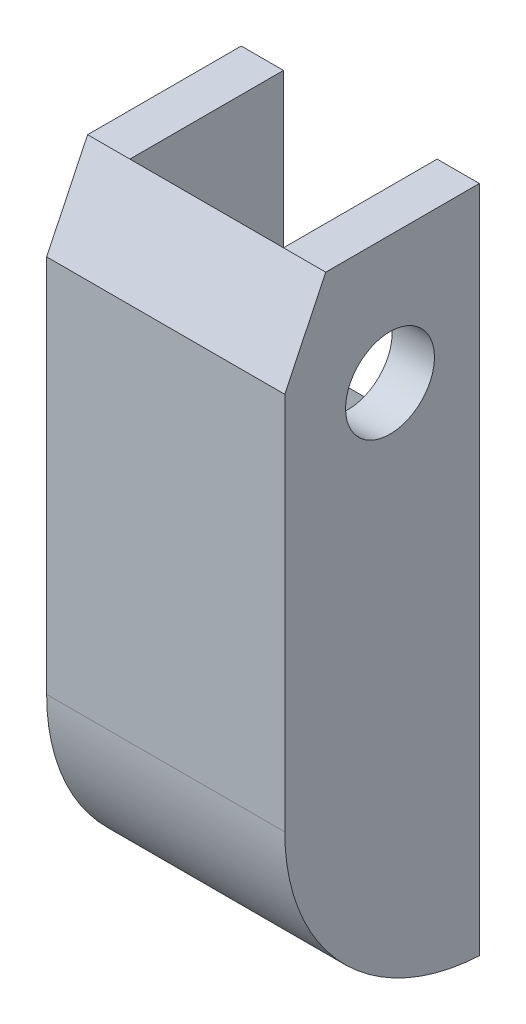
ISO-10303-21;
HEADER;
FILE_DESCRIPTION(('STEP AP214'),'2;1');
FILE_NAME('part.step','',(''),(''),'','','');
FILE_SCHEMA(('AUTOMOTIVE_DESIGN { 1 0 10303 214 1 1 1 1 }'));
ENDSEC;
DATA;
#1=APPLICATION_CONTEXT('core data for automotive mechanical design processes');
#2=APPLICATION_PROTOCOL_DEFINITION('international standard','automotive_design',2000,#1);
#3=PRODUCT_CONTEXT('',#1,'mechanical');
#4=PRODUCT('Part','Part','',(#3));
#5=PRODUCT_RELATED_PRODUCT_CATEGORY('part','',(#4));
#6=PRODUCT_DEFINITION_FORMATION('','',#4);
#7=PRODUCT_DEFINITION_CONTEXT('part definition',#1,'design');
#8=PRODUCT_DEFINITION('design','',#6,#7);
#9=PRODUCT_DEFINITION_SHAPE('','',#8);
#10=(LENGTH_UNIT() NAMED_UNIT(*) SI_UNIT(.MILLI.,.METRE.));
#11=(NAMED_UNIT(*) PLANE_ANGLE_UNIT() SI_UNIT($,.RADIAN.));
#12=(NAMED_UNIT(*) SI_UNIT($,.STERADIAN.) SOLID_ANGLE_UNIT());
#13=UNCERTAINTY_MEASURE_WITH_UNIT(LENGTH_MEASURE(1.E-05),#10,'distance_accuracy_value','');
#14=(GEOMETRIC_REPRESENTATION_CONTEXT(3) GLOBAL_UNCERTAINTY_ASSIGNED_CONTEXT((#13)) GLOBAL_UNIT_ASSIGNED_CONTEXT((#10,
#11,#12)) REPRESENTATION_CONTEXT('',''));
#15=CARTESIAN_POINT('',(0.,0.,0.));
#16=DIRECTION('',(0.,0.,1.));
#17=DIRECTION('',(1.,0.,0.));
#18=AXIS2_PLACEMENT_3D('',#15,#16,#17);
#19=CARTESIAN_POINT('',(0.,0.,7.62));
#20=DIRECTION('',(0.,0.,-1.));
#21=DIRECTION('',(-1.,0.,0.));
#22=AXIS2_PLACEMENT_3D('',#19,#20,#21);
#23=PLANE('',#22);
#24=DIRECTION('',(0.,-1.,0.));
#25=VECTOR('',#24,1.);
#26=CARTESIAN_POINT('',(9.7155,45.98924,7.62));
#27=LINE('',#26,#25);
#28=CARTESIAN_POINT('',(9.7155,33.17494,7.62));
#29=VERTEX_POINT('',#28);
#30=CARTESIAN_POINT('',(9.7155,26.82494,7.62));
#31=VERTEX_POINT('',#30);
#32=EDGE_CURVE('E188',#29,#31,#27,.T.);
#33=ORIENTED_EDGE('',*,*,#32,.T.);
#34=DIRECTION('',(1.,0.,0.));
#35=VECTOR('',#34,1.);
#36=CARTESIAN_POINT('',(-1.93222127853174,26.82494,7.62));
#37=LINE('',#36,#35);
#38=CARTESIAN_POINT('',(2.0955,26.82494,7.62));
#39=VERTEX_POINT('',#38);
#40=EDGE_CURVE('E141',#39,#31,#37,.T.);
#41=ORIENTED_EDGE('',*,*,#40,.F.);
#42=DIRECTION('',(0.,1.,0.));
#43=VECTOR('',#42,1.);
#44=CARTESIAN_POINT('',(2.0955,45.98924,7.62));
#45=LINE('',#44,#43);
#46=CARTESIAN_POINT('',(2.0955,33.17494,7.62));
#47=VERTEX_POINT('',#46);
#48=EDGE_CURVE('E146',#39,#47,#45,.T.);
#49=ORIENTED_EDGE('',*,*,#48,.T.);
#50=DIRECTION('',(-1.,0.,0.));
#51=VECTOR('',#50,1.);
#52=CARTESIAN_POINT('',(0.,33.17494,7.62));
#53=LINE('',#52,#51);
#54=EDGE_CURVE('E12',#29,#47,#53,.T.);
#55=ORIENTED_EDGE('',*,*,#54,.F.);
#56=EDGE_LOOP('',(#33,#41,#49,#55));
#57=FACE_BOUND('',#56,.T.);
#58=ADVANCED_FACE('F43',(#57),#23,.T.);
#59=CARTESIAN_POINT('',(11.811,0.,9.652));
#60=DIRECTION('',(-1.,0.,0.));
#61=DIRECTION('',(0.,0.,1.));
#62=AXIS2_PLACEMENT_3D('',#59,#60,#61);
#63=PLANE('',#62);
#64=CARTESIAN_POINT('',(11.811,26.82494,4.4323));
#65=DIRECTION('',(-1.,0.,0.));
#66=DIRECTION('',(0.,0.,1.));
#67=AXIS2_PLACEMENT_3D('',#64,#65,#66);
#68=CIRCLE('',#67,2.20345);
#69=CARTESIAN_POINT('',(11.811,26.82494,6.63575));
#70=VERTEX_POINT('',#69);
#71=EDGE_CURVE('E177',#70,#70,#68,.T.);
#72=ORIENTED_EDGE('',*,*,#71,.T.);
#73=EDGE_LOOP('',(#72));
#74=FACE_BOUND('',#73,.T.);
#75=DIRECTION('',(0.,1.,0.));
#76=VECTOR('',#75,1.);
#77=CARTESIAN_POINT('',(11.811,0.,0.));
#78=LINE('',#77,#76);
#79=CARTESIAN_POINT('',(11.811,0.,0.));
#80=VERTEX_POINT('',#79);
#81=CARTESIAN_POINT('',(11.811,33.17494,0.));
#82=VERTEX_POINT('',#81);
#83=EDGE_CURVE('E205',#80,#82,#78,.T.);
#84=ORIENTED_EDGE('',*,*,#83,.T.);
#85=DIRECTION('',(0.,0.,-1.));
#86=VECTOR('',#85,1.);
#87=CARTESIAN_POINT('',(11.811,33.17494,7.62));
#88=LINE('',#87,#86);
#89=CARTESIAN_POINT('',(11.811,33.17494,7.62));
#90=VERTEX_POINT('',#89);
#91=EDGE_CURVE('E158',#90,#82,#88,.T.);
#92=ORIENTED_EDGE('',*,*,#91,.F.);
#93=DIRECTION('',(0.,0.901435014436662,-0.432914442756967));
#94=VECTOR('',#93,1.);
#95=CARTESIAN_POINT('',(11.811,28.9438130880166,9.652));
#96=LINE('',#95,#94);
#97=CARTESIAN_POINT('',(11.811,28.9438130880166,9.652));
#98=VERTEX_POINT('',#97);
#99=EDGE_CURVE('E153',#98,#90,#96,.T.);
#100=ORIENTED_EDGE('',*,*,#99,.F.);
#101=DIRECTION('',(0.,1.,0.));
#102=VECTOR('',#101,1.);
#103=CARTESIAN_POINT('',(11.811,0.,9.652));
#104=LINE('',#103,#102);
#105=CARTESIAN_POINT('',(11.811,10.1472920525626,9.652));
#106=VERTEX_POINT('',#105);
#107=EDGE_CURVE('E196',#106,#98,#104,.T.);
#108=ORIENTED_EDGE('',*,*,#107,.F.);
#109=CARTESIAN_POINT('',(11.811,10.1472920525626,-0.508000000000002));
#110=DIRECTION('',(-1.,0.,0.));
#111=DIRECTION('',(0.,0.,1.));
#112=AXIS2_PLACEMENT_3D('',#109,#110,#111);
#113=CIRCLE('',#112,10.16);
#114=EDGE_CURVE('E214',#106,#80,#113,.F.);
#115=ORIENTED_EDGE('',*,*,#114,.T.);
#116=EDGE_LOOP('',(#84,#92,#100,#108,#115));
#117=FACE_BOUND('',#116,.T.);
#118=ADVANCED_FACE('F218',(#74,#117),#63,.F.);
#119=CARTESIAN_POINT('',(0.,0.,9.652));
#120=DIRECTION('',(-1.,0.,0.));
#121=DIRECTION('',(0.,0.,1.));
#122=AXIS2_PLACEMENT_3D('',#119,#120,#121);
#123=PLANE('',#122);
#124=DIRECTION('',(0.,0.,-1.));
#125=VECTOR('',#124,1.);
#126=CARTESIAN_POINT('',(0.,33.17494,7.62));
#127=LINE('',#126,#125);
#128=CARTESIAN_POINT('',(0.,33.17494,7.62));
#129=VERTEX_POINT('',#128);
#130=CARTESIAN_POINT('',(0.,33.17494,0.));
#131=VERTEX_POINT('',#130);
#132=EDGE_CURVE('E157',#129,#131,#127,.T.);
#133=ORIENTED_EDGE('',*,*,#132,.T.);
#134=DIRECTION('',(0.,1.,0.));
#135=VECTOR('',#134,1.);
#136=CARTESIAN_POINT('',(0.,0.,0.));
#137=LINE('',#136,#135);
#138=CARTESIAN_POINT('',(0.,0.,0.));
#139=VERTEX_POINT('',#138);
#140=EDGE_CURVE('E200',#139,#131,#137,.T.);
#141=ORIENTED_EDGE('',*,*,#140,.F.);
#142=CARTESIAN_POINT('',(0.,10.1472920525626,-0.508000000000002));
#143=DIRECTION('',(-1.,0.,0.));
#144=DIRECTION('',(0.,0.,1.));
#145=AXIS2_PLACEMENT_3D('',#142,#143,#144);
#146=CIRCLE('',#145,10.16);
#147=CARTESIAN_POINT('',(0.,10.1472920525626,9.652));
#148=VERTEX_POINT('',#147);
#149=EDGE_CURVE('E51',#139,#148,#146,.T.);
#150=ORIENTED_EDGE('',*,*,#149,.T.);
#151=DIRECTION('',(0.,1.,0.));
#152=VECTOR('',#151,1.);
#153=CARTESIAN_POINT('',(0.,0.,9.652));
#154=LINE('',#153,#152);
#155=CARTESIAN_POINT('',(0.,28.9438130880166,9.652));
#156=VERTEX_POINT('',#155);
#157=EDGE_CURVE('E199',#148,#156,#154,.T.);
#158=ORIENTED_EDGE('',*,*,#157,.T.);
#159=DIRECTION('',(0.,0.901435014436662,-0.432914442756967));
#160=VECTOR('',#159,1.);
#161=CARTESIAN_POINT('',(0.,28.9438130880166,9.652));
#162=LINE('',#161,#160);
#163=EDGE_CURVE('E154',#156,#129,#162,.T.);
#164=ORIENTED_EDGE('',*,*,#163,.T.);
#165=EDGE_LOOP('',(#133,#141,#150,#158,#164));
#166=FACE_BOUND('',#165,.T.);
#167=CARTESIAN_POINT('',(0.,26.82494,4.4323));
#168=DIRECTION('',(-1.,0.,0.));
#169=DIRECTION('',(0.,0.,1.));
#170=AXIS2_PLACEMENT_3D('',#167,#168,#169);
#171=CIRCLE('',#170,2.20345);
#172=CARTESIAN_POINT('',(0.,26.82494,6.63575));
#173=VERTEX_POINT('',#172);
#174=EDGE_CURVE('E184',#173,#173,#171,.T.);
#175=ORIENTED_EDGE('',*,*,#174,.F.);
#176=EDGE_LOOP('',(#175));
#177=FACE_BOUND('',#176,.T.);
#178=ADVANCED_FACE('F230',(#166,#177),#123,.T.);
#179=CARTESIAN_POINT('',(0.,0.,9.652));
#180=DIRECTION('',(0.,0.,1.));
#181=DIRECTION('',(1.,0.,0.));
#182=AXIS2_PLACEMENT_3D('',#179,#180,#181);
#183=PLANE('',#182);
#184=DIRECTION('',(1.,0.,0.));
#185=VECTOR('',#184,1.);
#186=CARTESIAN_POINT('',(0.,28.9438130880166,9.652));
#187=LINE('',#186,#185);
#188=EDGE_CURVE('E161',#156,#98,#187,.T.);
#189=ORIENTED_EDGE('',*,*,#188,.F.);
#190=ORIENTED_EDGE('',*,*,#157,.F.);
#191=DIRECTION('',(-1.,0.,0.));
#192=VECTOR('',#191,1.);
#193=CARTESIAN_POINT('',(11.811,10.1472920525626,9.652));
#194=LINE('',#193,#192);
#195=EDGE_CURVE('E202',#148,#106,#194,.F.);
#196=ORIENTED_EDGE('',*,*,#195,.T.);
#197=ORIENTED_EDGE('',*,*,#107,.T.);
#198=EDGE_LOOP('',(#189,#190,#196,#197));
#199=FACE_BOUND('',#198,.T.);
#200=ADVANCED_FACE('F229',(#199),#183,.T.);
#201=CARTESIAN_POINT('',(0.,0.,0.));
#202=DIRECTION('',(0.,0.,1.));
#203=DIRECTION('',(1.,0.,0.));
#204=AXIS2_PLACEMENT_3D('',#201,#202,#203);
#205=PLANE('',#204);
#206=DIRECTION('',(0.,1.,0.));
#207=VECTOR('',#206,1.);
#208=CARTESIAN_POINT('',(2.0955,45.98924,0.));
#209=LINE('',#208,#207);
#210=CARTESIAN_POINT('',(2.0955,21.1600760854083,0.));
#211=VERTEX_POINT('',#210);
#212=CARTESIAN_POINT('',(2.0955,33.17494,0.));
#213=VERTEX_POINT('',#212);
#214=EDGE_CURVE('E191',#211,#213,#209,.T.);
#215=ORIENTED_EDGE('',*,*,#214,.F.);
#216=DIRECTION('',(1.,0.,0.));
#217=VECTOR('',#216,1.);
#218=CARTESIAN_POINT('',(-3.62656346089119,21.1600760854083,0.));
#219=LINE('',#218,#217);
#220=CARTESIAN_POINT('',(9.7155,21.1600760854083,0.));
#221=VERTEX_POINT('',#220);
#222=EDGE_CURVE('E129',#211,#221,#219,.T.);
#223=ORIENTED_EDGE('',*,*,#222,.T.);
#224=DIRECTION('',(0.,-1.,0.));
#225=VECTOR('',#224,1.);
#226=CARTESIAN_POINT('',(9.7155,45.98924,0.));
#227=LINE('',#226,#225);
#228=CARTESIAN_POINT('',(9.7155,33.17494,0.));
#229=VERTEX_POINT('',#228);
#230=EDGE_CURVE('E187',#229,#221,#227,.T.);
#231=ORIENTED_EDGE('',*,*,#230,.F.);
#232=DIRECTION('',(1.,0.,0.));
#233=VECTOR('',#232,1.);
#234=CARTESIAN_POINT('',(0.,33.17494,0.));
#235=LINE('',#234,#233);
#236=EDGE_CURVE('E168',#229,#82,#235,.T.);
#237=ORIENTED_EDGE('',*,*,#236,.T.);
#238=ORIENTED_EDGE('',*,*,#83,.F.);
#239=DIRECTION('',(1.,0.,0.));
#240=VECTOR('',#239,1.);
#241=CARTESIAN_POINT('',(0.,0.,0.));
#242=LINE('',#241,#240);
#243=EDGE_CURVE('E193',#139,#80,#242,.T.);
#244=ORIENTED_EDGE('',*,*,#243,.F.);
#245=ORIENTED_EDGE('',*,*,#140,.T.);
#246=EDGE_CURVE('E164',#131,#213,#235,.T.);
#247=ORIENTED_EDGE('',*,*,#246,.T.);
#248=EDGE_LOOP('',(#215,#223,#231,#237,#238,#244,#245,#247));
#249=FACE_BOUND('',#248,.T.);
#250=ADVANCED_FACE('F225',(#249),#205,.F.);
#251=CARTESIAN_POINT('',(9.7155,45.98924,7.62));
#252=DIRECTION('',(1.,0.,0.));
#253=DIRECTION('',(0.,1.,0.));
#254=AXIS2_PLACEMENT_3D('',#251,#252,#253);
#255=PLANE('',#254);
#256=CARTESIAN_POINT('',(9.7155,26.82494,4.4323));
#257=DIRECTION('',(1.,0.,0.));
#258=DIRECTION('',(0.,1.,0.));
#259=AXIS2_PLACEMENT_3D('',#256,#257,#258);
#260=CIRCLE('',#259,2.20345);
#261=CARTESIAN_POINT('',(9.7155,29.02839,4.4323));
#262=VERTEX_POINT('',#261);
#263=EDGE_CURVE('E181',#262,#262,#260,.T.);
#264=ORIENTED_EDGE('',*,*,#263,.T.);
#265=EDGE_LOOP('',(#264));
#266=FACE_BOUND('',#265,.T.);
#267=DIRECTION('',(0.,-0.432914442756968,-0.901435014436662));
#268=VECTOR('',#267,1.);
#269=CARTESIAN_POINT('',(9.7155,17.1943622298093,-8.25759774589093));
#270=LINE('',#269,#268);
#271=CARTESIAN_POINT('',(9.7155,23.9514356044802,5.81230136917639));
#272=VERTEX_POINT('',#271);
#273=EDGE_CURVE('E133',#272,#221,#270,.T.);
#274=ORIENTED_EDGE('',*,*,#273,.F.);
#275=CARTESIAN_POINT('',(9.7155,26.82494,4.4323));
#276=DIRECTION('',(-1.,0.,0.));
#277=DIRECTION('',(0.,-1.,0.));
#278=AXIS2_PLACEMENT_3D('',#275,#276,#277);
#279=CIRCLE('',#278,3.1877);
#280=EDGE_CURVE('E140',#272,#31,#279,.T.);
#281=ORIENTED_EDGE('',*,*,#280,.T.);
#282=ORIENTED_EDGE('',*,*,#32,.F.);
#283=DIRECTION('',(0.,0.,-1.));
#284=VECTOR('',#283,1.);
#285=CARTESIAN_POINT('',(9.7155,33.17494,7.62));
#286=LINE('',#285,#284);
#287=EDGE_CURVE('E174',#29,#229,#286,.T.);
#288=ORIENTED_EDGE('',*,*,#287,.T.);
#289=ORIENTED_EDGE('',*,*,#230,.T.);
#290=EDGE_LOOP('',(#274,#281,#282,#288,#289));
#291=FACE_BOUND('',#290,.T.);
#292=ADVANCED_FACE('F238',(#266,#291),#255,.F.);
#293=CARTESIAN_POINT('',(2.0955,45.98924,7.62));
#294=DIRECTION('',(-1.,0.,0.));
#295=DIRECTION('',(0.,-1.,0.));
#296=AXIS2_PLACEMENT_3D('',#293,#294,#295);
#297=PLANE('',#296);
#298=CARTESIAN_POINT('',(2.0955,26.82494,4.4323));
#299=DIRECTION('',(-1.,0.,0.));
#300=DIRECTION('',(0.,-1.,0.));
#301=AXIS2_PLACEMENT_3D('',#298,#299,#300);
#302=CIRCLE('',#301,2.20345);
#303=CARTESIAN_POINT('',(2.0955,24.62149,4.4323));
#304=VERTEX_POINT('',#303);
#305=EDGE_CURVE('E180',#304,#304,#302,.T.);
#306=ORIENTED_EDGE('',*,*,#305,.T.);
#307=EDGE_LOOP('',(#306));
#308=FACE_BOUND('',#307,.T.);
#309=ORIENTED_EDGE('',*,*,#48,.F.);
#310=CARTESIAN_POINT('',(2.0955,26.82494,4.4323));
#311=DIRECTION('',(-1.,0.,0.));
#312=DIRECTION('',(0.,-1.,0.));
#313=AXIS2_PLACEMENT_3D('',#310,#311,#312);
#314=CIRCLE('',#313,3.1877);
#315=CARTESIAN_POINT('',(2.0955,23.9514356044802,5.81230136917639));
#316=VERTEX_POINT('',#315);
#317=EDGE_CURVE('E137',#316,#39,#314,.T.);
#318=ORIENTED_EDGE('',*,*,#317,.F.);
#319=DIRECTION('',(0.,-0.432914442756968,-0.901435014436662));
#320=VECTOR('',#319,1.);
#321=CARTESIAN_POINT('',(2.0955,17.1943622298093,-8.25759774589093));
#322=LINE('',#321,#320);
#323=EDGE_CURVE('E122',#316,#211,#322,.T.);
#324=ORIENTED_EDGE('',*,*,#323,.T.);
#325=ORIENTED_EDGE('',*,*,#214,.T.);
#326=DIRECTION('',(0.,0.,1.));
#327=VECTOR('',#326,1.);
#328=CARTESIAN_POINT('',(2.0955,33.17494,7.62));
#329=LINE('',#328,#327);
#330=EDGE_CURVE('E167',#213,#47,#329,.T.);
#331=ORIENTED_EDGE('',*,*,#330,.T.);
#332=EDGE_LOOP('',(#309,#318,#324,#325,#331));
#333=FACE_BOUND('',#332,.T.);
#334=ADVANCED_FACE('F144',(#308,#333),#297,.F.);
#335=CARTESIAN_POINT('',(11.811,26.82494,4.4323));
#336=DIRECTION('',(-1.,0.,0.));
#337=DIRECTION('',(0.,0.,1.));
#338=AXIS2_PLACEMENT_3D('',#335,#336,#337);
#339=CYLINDRICAL_SURFACE('',#338,2.20345);
#340=ORIENTED_EDGE('',*,*,#174,.T.);
#341=EDGE_LOOP('',(#340));
#342=FACE_BOUND('',#341,.T.);
#343=ORIENTED_EDGE('',*,*,#305,.F.);
#344=EDGE_LOOP('',(#343));
#345=FACE_BOUND('',#344,.T.);
#346=ADVANCED_FACE('F255',(#342,#345),#339,.F.);
#347=ORIENTED_EDGE('',*,*,#71,.F.);
#348=EDGE_LOOP('',(#347));
#349=FACE_BOUND('',#348,.T.);
#350=ORIENTED_EDGE('',*,*,#263,.F.);
#351=EDGE_LOOP('',(#350));
#352=FACE_BOUND('',#351,.T.);
#353=ADVANCED_FACE('F251',(#349,#352),#339,.F.);
#354=CARTESIAN_POINT('',(0.,10.1472920525626,-0.508000000000002));
#355=DIRECTION('',(1.,0.,0.));
#356=DIRECTION('',(0.,0.,-1.));
#357=AXIS2_PLACEMENT_3D('',#354,#355,#356);
#358=CYLINDRICAL_SURFACE('',#357,10.16);
#359=ORIENTED_EDGE('',*,*,#149,.F.);
#360=ORIENTED_EDGE('',*,*,#243,.T.);
#361=ORIENTED_EDGE('',*,*,#114,.F.);
#362=ORIENTED_EDGE('',*,*,#195,.F.);
#363=EDGE_LOOP('',(#359,#360,#361,#362));
#364=FACE_BOUND('',#363,.T.);
#365=ADVANCED_FACE('F45',(#364),#358,.T.);
#366=CARTESIAN_POINT('',(0.,33.17494,7.62));
#367=DIRECTION('',(0.,-1.,0.));
#368=DIRECTION('',(0.,0.,-1.));
#369=AXIS2_PLACEMENT_3D('',#366,#367,#368);
#370=PLANE('',#369);
#371=DIRECTION('',(1.,0.,0.));
#372=VECTOR('',#371,1.);
#373=CARTESIAN_POINT('',(0.,33.17494,7.62));
#374=LINE('',#373,#372);
#375=EDGE_CURVE('E57',#29,#90,#374,.T.);
#376=ORIENTED_EDGE('',*,*,#375,.T.);
#377=ORIENTED_EDGE('',*,*,#91,.T.);
#378=ORIENTED_EDGE('',*,*,#236,.F.);
#379=ORIENTED_EDGE('',*,*,#287,.F.);
#380=EDGE_LOOP('',(#376,#377,#378,#379));
#381=FACE_BOUND('',#380,.T.);
#382=ADVANCED_FACE('F241',(#381),#370,.F.);
#383=ORIENTED_EDGE('',*,*,#246,.F.);
#384=ORIENTED_EDGE('',*,*,#132,.F.);
#385=EDGE_CURVE('E169',#129,#47,#374,.T.);
#386=ORIENTED_EDGE('',*,*,#385,.T.);
#387=ORIENTED_EDGE('',*,*,#330,.F.);
#388=EDGE_LOOP('',(#383,#384,#386,#387));
#389=FACE_BOUND('',#388,.T.);
#390=ADVANCED_FACE('F236',(#389),#370,.F.);
#391=CARTESIAN_POINT('',(0.,28.9438130880166,9.652));
#392=DIRECTION('',(0.,-0.432914442756967,-0.901435014436662));
#393=DIRECTION('',(0.,0.901435014436662,-0.432914442756967));
#394=AXIS2_PLACEMENT_3D('',#391,#392,#393);
#395=PLANE('',#394);
#396=ORIENTED_EDGE('',*,*,#99,.T.);
#397=ORIENTED_EDGE('',*,*,#375,.F.);
#398=ORIENTED_EDGE('',*,*,#54,.T.);
#399=ORIENTED_EDGE('',*,*,#385,.F.);
#400=ORIENTED_EDGE('',*,*,#163,.F.);
#401=ORIENTED_EDGE('',*,*,#188,.T.);
#402=EDGE_LOOP('',(#396,#397,#398,#399,#400,#401));
#403=FACE_BOUND('',#402,.T.);
#404=ADVANCED_FACE('F233',(#403),#395,.F.);
#405=CARTESIAN_POINT('',(-3.62656346089119,17.1943622298093,-8.25759774589093));
#406=DIRECTION('',(0.,-0.901435014436661,0.432914442756968));
#407=DIRECTION('',(0.,-0.432914442756968,-0.901435014436661));
#408=AXIS2_PLACEMENT_3D('',#405,#406,#407);
#409=PLANE('',#408);
#410=ORIENTED_EDGE('',*,*,#323,.F.);
#411=DIRECTION('',(1.,0.,0.));
#412=VECTOR('',#411,1.);
#413=CARTESIAN_POINT('',(-1.93222127853174,23.9514356044802,5.81230136917639));
#414=LINE('',#413,#412);
#415=EDGE_CURVE('E126',#316,#272,#414,.T.);
#416=ORIENTED_EDGE('',*,*,#415,.T.);
#417=ORIENTED_EDGE('',*,*,#273,.T.);
#418=ORIENTED_EDGE('',*,*,#222,.F.);
#419=EDGE_LOOP('',(#410,#416,#417,#418));
#420=FACE_BOUND('',#419,.T.);
#421=ADVANCED_FACE('F124',(#420),#409,.F.);
#422=CARTESIAN_POINT('',(-1.93222127853174,26.82494,4.4323));
#423=DIRECTION('',(1.,0.,0.));
#424=DIRECTION('',(0.,1.,0.));
#425=AXIS2_PLACEMENT_3D('',#422,#423,#424);
#426=CYLINDRICAL_SURFACE('',#425,3.1877);
#427=ORIENTED_EDGE('',*,*,#415,.F.);
#428=ORIENTED_EDGE('',*,*,#317,.T.);
#429=ORIENTED_EDGE('',*,*,#40,.T.);
#430=ORIENTED_EDGE('',*,*,#280,.F.);
#431=EDGE_LOOP('',(#427,#428,#429,#430));
#432=FACE_BOUND('',#431,.T.);
#433=ADVANCED_FACE('F136',(#432),#426,.F.);
#434=CLOSED_SHELL('',(#58,#118,#178,#200,#250,#292,#334,#346,#353,#365,#382,#390,#404,#421,#433));
#435=MANIFOLD_SOLID_BREP('B2',#434);
#436=ADVANCED_BREP_SHAPE_REPRESENTATION('',(#18,#435),#14);
#437=SHAPE_DEFINITION_REPRESENTATION(#9,#436);
ENDSEC;
END-ISO-10303-21;
